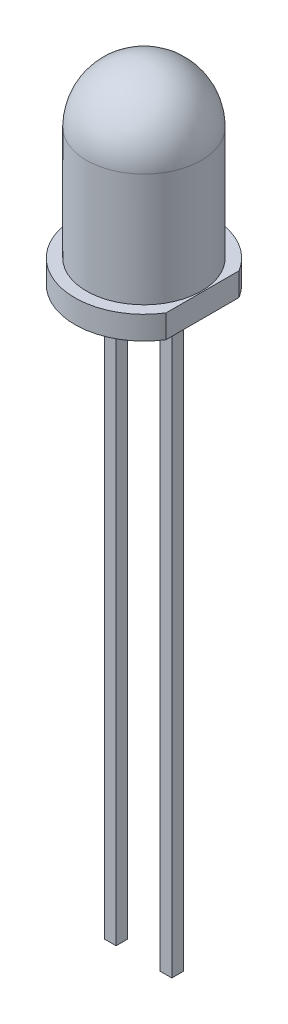
ISO-10303-21;
HEADER;
FILE_DESCRIPTION(('STEP AP214'),'2;1');
FILE_NAME('part.step','',(''),(''),'','','');
FILE_SCHEMA(('AUTOMOTIVE_DESIGN { 1 0 10303 214 1 1 1 1 }'));
ENDSEC;
DATA;
#1=APPLICATION_CONTEXT('core data for automotive mechanical design processes');
#2=APPLICATION_PROTOCOL_DEFINITION('international standard','automotive_design',2000,#1);
#3=PRODUCT_CONTEXT('',#1,'mechanical');
#4=PRODUCT('Part','Part','',(#3));
#5=PRODUCT_RELATED_PRODUCT_CATEGORY('part','',(#4));
#6=PRODUCT_DEFINITION_FORMATION('','',#4);
#7=PRODUCT_DEFINITION_CONTEXT('part definition',#1,'design');
#8=PRODUCT_DEFINITION('design','',#6,#7);
#9=PRODUCT_DEFINITION_SHAPE('','',#8);
#10=(LENGTH_UNIT() NAMED_UNIT(*) SI_UNIT(.MILLI.,.METRE.));
#11=(NAMED_UNIT(*) PLANE_ANGLE_UNIT() SI_UNIT($,.RADIAN.));
#12=(NAMED_UNIT(*) SI_UNIT($,.STERADIAN.) SOLID_ANGLE_UNIT());
#13=UNCERTAINTY_MEASURE_WITH_UNIT(LENGTH_MEASURE(1.E-05),#10,'distance_accuracy_value','');
#14=(GEOMETRIC_REPRESENTATION_CONTEXT(3) GLOBAL_UNCERTAINTY_ASSIGNED_CONTEXT((#13)) GLOBAL_UNIT_ASSIGNED_CONTEXT((#10,
#11,#12)) REPRESENTATION_CONTEXT('',''));
#15=CARTESIAN_POINT('',(0.,0.,0.));
#16=DIRECTION('',(0.,0.,1.));
#17=DIRECTION('',(1.,0.,0.));
#18=AXIS2_PLACEMENT_3D('',#15,#16,#17);
#19=CARTESIAN_POINT('',(0.,0.,0.));
#20=DIRECTION('',(0.,1.,0.));
#21=DIRECTION('',(0.,0.,1.));
#22=AXIS2_PLACEMENT_3D('',#19,#20,#21);
#23=PLANE('',#22);
#24=DIRECTION('',(0.,0.,-1.));
#25=VECTOR('',#24,1.);
#26=CARTESIAN_POINT('',(0.95,0.,0.25));
#27=LINE('',#26,#25);
#28=CARTESIAN_POINT('',(0.95,0.,0.25));
#29=VERTEX_POINT('',#28);
#30=CARTESIAN_POINT('',(0.95,0.,-0.25));
#31=VERTEX_POINT('',#30);
#32=EDGE_CURVE('E141',#29,#31,#27,.T.);
#33=ORIENTED_EDGE('',*,*,#32,.F.);
#34=DIRECTION('',(-1.,0.,0.));
#35=VECTOR('',#34,1.);
#36=CARTESIAN_POINT('',(0.95,0.,0.25));
#37=LINE('',#36,#35);
#38=CARTESIAN_POINT('',(1.45,0.,0.25));
#39=VERTEX_POINT('',#38);
#40=EDGE_CURVE('E157',#39,#29,#37,.T.);
#41=ORIENTED_EDGE('',*,*,#40,.F.);
#42=DIRECTION('',(0.,0.,1.));
#43=VECTOR('',#42,1.);
#44=CARTESIAN_POINT('',(1.45,0.,0.25));
#45=LINE('',#44,#43);
#46=CARTESIAN_POINT('',(1.45,0.,-0.25));
#47=VERTEX_POINT('',#46);
#48=EDGE_CURVE('E170',#47,#39,#45,.T.);
#49=ORIENTED_EDGE('',*,*,#48,.F.);
#50=DIRECTION('',(1.,0.,0.));
#51=VECTOR('',#50,1.);
#52=CARTESIAN_POINT('',(0.95,0.,-0.25));
#53=LINE('',#52,#51);
#54=EDGE_CURVE('E146',#31,#47,#53,.T.);
#55=ORIENTED_EDGE('',*,*,#54,.F.);
#56=EDGE_LOOP('',(#33,#41,#49,#55));
#57=FACE_BOUND('',#56,.T.);
#58=CARTESIAN_POINT('',(0.,0.,0.));
#59=DIRECTION('',(0.,1.,0.));
#60=DIRECTION('',(0.,0.,1.));
#61=AXIS2_PLACEMENT_3D('',#58,#59,#60);
#62=CIRCLE('',#61,2.975);
#63=CARTESIAN_POINT('',(2.525,0.,-1.57321327225523));
#64=VERTEX_POINT('',#63);
#65=CARTESIAN_POINT('',(2.525,0.,1.57321327225523));
#66=VERTEX_POINT('',#65);
#67=EDGE_CURVE('E200',#64,#66,#62,.T.);
#68=ORIENTED_EDGE('',*,*,#67,.F.);
#69=DIRECTION('',(0.,0.,-1.));
#70=VECTOR('',#69,1.);
#71=CARTESIAN_POINT('',(2.525,0.,1.57321327225523));
#72=LINE('',#71,#70);
#73=EDGE_CURVE('E206',#66,#64,#72,.T.);
#74=ORIENTED_EDGE('',*,*,#73,.F.);
#75=EDGE_LOOP('',(#68,#74));
#76=FACE_BOUND('',#75,.T.);
#77=DIRECTION('',(0.,0.,-1.));
#78=VECTOR('',#77,1.);
#79=CARTESIAN_POINT('',(-1.45,0.,0.25));
#80=LINE('',#79,#78);
#81=CARTESIAN_POINT('',(-1.45,0.,0.25));
#82=VERTEX_POINT('',#81);
#83=CARTESIAN_POINT('',(-1.45,0.,-0.25));
#84=VERTEX_POINT('',#83);
#85=EDGE_CURVE('E139',#82,#84,#80,.T.);
#86=ORIENTED_EDGE('',*,*,#85,.F.);
#87=DIRECTION('',(-1.,0.,0.));
#88=VECTOR('',#87,1.);
#89=CARTESIAN_POINT('',(-1.45,0.,0.25));
#90=LINE('',#89,#88);
#91=CARTESIAN_POINT('',(-0.95,0.,0.25));
#92=VERTEX_POINT('',#91);
#93=EDGE_CURVE('E136',#92,#82,#90,.T.);
#94=ORIENTED_EDGE('',*,*,#93,.F.);
#95=DIRECTION('',(0.,0.,1.));
#96=VECTOR('',#95,1.);
#97=CARTESIAN_POINT('',(-0.95,0.,0.25));
#98=LINE('',#97,#96);
#99=CARTESIAN_POINT('',(-0.95,0.,-0.25));
#100=VERTEX_POINT('',#99);
#101=EDGE_CURVE('E60',#100,#92,#98,.T.);
#102=ORIENTED_EDGE('',*,*,#101,.F.);
#103=DIRECTION('',(1.,0.,0.));
#104=VECTOR('',#103,1.);
#105=CARTESIAN_POINT('',(-1.45,0.,-0.25));
#106=LINE('',#105,#104);
#107=EDGE_CURVE('E55',#84,#100,#106,.T.);
#108=ORIENTED_EDGE('',*,*,#107,.F.);
#109=EDGE_LOOP('',(#86,#94,#102,#108));
#110=FACE_BOUND('',#109,.T.);
#111=ADVANCED_FACE('F39',(#57,#76,#110),#23,.F.);
#112=CARTESIAN_POINT('',(0.,1.,0.));
#113=DIRECTION('',(0.,-1.,0.));
#114=DIRECTION('',(0.,0.,-1.));
#115=AXIS2_PLACEMENT_3D('',#112,#113,#114);
#116=CYLINDRICAL_SURFACE('',#115,2.975);
#117=ORIENTED_EDGE('',*,*,#67,.T.);
#118=DIRECTION('',(0.,-1.,0.));
#119=VECTOR('',#118,1.);
#120=CARTESIAN_POINT('',(2.525,1.,1.57321327225523));
#121=LINE('',#120,#119);
#122=CARTESIAN_POINT('',(2.525,1.,1.57321327225523));
#123=VERTEX_POINT('',#122);
#124=EDGE_CURVE('E11',#123,#66,#121,.T.);
#125=ORIENTED_EDGE('',*,*,#124,.F.);
#126=CARTESIAN_POINT('',(0.,1.,0.));
#127=DIRECTION('',(0.,1.,0.));
#128=DIRECTION('',(0.,0.,1.));
#129=AXIS2_PLACEMENT_3D('',#126,#127,#128);
#130=CIRCLE('',#129,2.975);
#131=CARTESIAN_POINT('',(2.525,1.,-1.57321327225523));
#132=VERTEX_POINT('',#131);
#133=EDGE_CURVE('E201',#132,#123,#130,.T.);
#134=ORIENTED_EDGE('',*,*,#133,.F.);
#135=DIRECTION('',(0.,-1.,0.));
#136=VECTOR('',#135,1.);
#137=CARTESIAN_POINT('',(2.525,1.,-1.57321327225523));
#138=LINE('',#137,#136);
#139=EDGE_CURVE('E48',#132,#64,#138,.T.);
#140=ORIENTED_EDGE('',*,*,#139,.T.);
#141=EDGE_LOOP('',(#117,#125,#134,#140));
#142=FACE_BOUND('',#141,.T.);
#143=ADVANCED_FACE('F41',(#142),#116,.T.);
#144=CARTESIAN_POINT('',(2.525,1.,1.57321327225523));
#145=DIRECTION('',(-1.,0.,0.));
#146=DIRECTION('',(0.,0.,1.));
#147=AXIS2_PLACEMENT_3D('',#144,#145,#146);
#148=PLANE('',#147);
#149=ORIENTED_EDGE('',*,*,#73,.T.);
#150=ORIENTED_EDGE('',*,*,#139,.F.);
#151=DIRECTION('',(0.,0.,-1.));
#152=VECTOR('',#151,1.);
#153=CARTESIAN_POINT('',(2.525,1.,1.57321327225523));
#154=LINE('',#153,#152);
#155=EDGE_CURVE('E205',#123,#132,#154,.T.);
#156=ORIENTED_EDGE('',*,*,#155,.F.);
#157=ORIENTED_EDGE('',*,*,#124,.T.);
#158=EDGE_LOOP('',(#149,#150,#156,#157));
#159=FACE_BOUND('',#158,.T.);
#160=ADVANCED_FACE('F222',(#159),#148,.F.);
#161=CARTESIAN_POINT('',(0.,1.,0.));
#162=DIRECTION('',(0.,1.,0.));
#163=DIRECTION('',(0.,0.,1.));
#164=AXIS2_PLACEMENT_3D('',#161,#162,#163);
#165=PLANE('',#164);
#166=CARTESIAN_POINT('',(0.,1.,0.));
#167=DIRECTION('',(0.,-1.,0.));
#168=DIRECTION('',(0.,0.,-1.));
#169=AXIS2_PLACEMENT_3D('',#166,#167,#168);
#170=CIRCLE('',#169,2.475);
#171=CARTESIAN_POINT('',(0.,1.,-2.475));
#172=VERTEX_POINT('',#171);
#173=EDGE_CURVE('E196',#172,#172,#170,.T.);
#174=ORIENTED_EDGE('',*,*,#173,.T.);
#175=EDGE_LOOP('',(#174));
#176=FACE_BOUND('',#175,.T.);
#177=ORIENTED_EDGE('',*,*,#133,.T.);
#178=ORIENTED_EDGE('',*,*,#155,.T.);
#179=EDGE_LOOP('',(#177,#178));
#180=FACE_BOUND('',#179,.T.);
#181=ADVANCED_FACE('F224',(#176,#180),#165,.T.);
#182=CARTESIAN_POINT('',(0.,5.875,0.));
#183=DIRECTION('',(0.,-1.,0.));
#184=DIRECTION('',(-1.,0.,0.));
#185=AXIS2_PLACEMENT_3D('',#182,#183,#184);
#186=SPHERICAL_SURFACE('',#185,2.475);
#187=CARTESIAN_POINT('',(0.,5.875,0.));
#188=DIRECTION('',(0.,-1.,0.));
#189=DIRECTION('',(0.,0.,-1.));
#190=AXIS2_PLACEMENT_3D('',#187,#188,#189);
#191=CIRCLE('',#190,2.475);
#192=CARTESIAN_POINT('',(0.,5.875,-2.475));
#193=VERTEX_POINT('',#192);
#194=EDGE_CURVE('E192',#193,#193,#191,.T.);
#195=ORIENTED_EDGE('',*,*,#194,.F.);
#196=EDGE_LOOP('',(#195));
#197=FACE_BOUND('',#196,.T.);
#198=ADVANCED_FACE('F226',(#197),#186,.T.);
#199=CARTESIAN_POINT('',(0.,0.,0.));
#200=DIRECTION('',(0.,-1.,0.));
#201=DIRECTION('',(0.,0.,-1.));
#202=AXIS2_PLACEMENT_3D('',#199,#200,#201);
#203=CYLINDRICAL_SURFACE('',#202,2.475);
#204=ORIENTED_EDGE('',*,*,#173,.F.);
#205=EDGE_LOOP('',(#204));
#206=FACE_BOUND('',#205,.T.);
#207=ORIENTED_EDGE('',*,*,#194,.T.);
#208=EDGE_LOOP('',(#207));
#209=FACE_BOUND('',#208,.T.);
#210=ADVANCED_FACE('F233',(#206,#209),#203,.T.);
#211=CARTESIAN_POINT('',(0.95,-25.,0.25));
#212=DIRECTION('',(1.,0.,0.));
#213=DIRECTION('',(0.,0.,-1.));
#214=AXIS2_PLACEMENT_3D('',#211,#212,#213);
#215=PLANE('',#214);
#216=ORIENTED_EDGE('',*,*,#32,.T.);
#217=DIRECTION('',(0.,1.,0.));
#218=VECTOR('',#217,1.);
#219=CARTESIAN_POINT('',(0.95,-25.,-0.25));
#220=LINE('',#219,#218);
#221=CARTESIAN_POINT('',(0.95,-25.,-0.25));
#222=VERTEX_POINT('',#221);
#223=EDGE_CURVE('E188',#222,#31,#220,.T.);
#224=ORIENTED_EDGE('',*,*,#223,.F.);
#225=DIRECTION('',(0.,0.,-1.));
#226=VECTOR('',#225,1.);
#227=CARTESIAN_POINT('',(0.95,-25.,0.25));
#228=LINE('',#227,#226);
#229=CARTESIAN_POINT('',(0.95,-25.,0.25));
#230=VERTEX_POINT('',#229);
#231=EDGE_CURVE('E152',#230,#222,#228,.T.);
#232=ORIENTED_EDGE('',*,*,#231,.F.);
#233=DIRECTION('',(0.,1.,0.));
#234=VECTOR('',#233,1.);
#235=CARTESIAN_POINT('',(0.95,-25.,0.25));
#236=LINE('',#235,#234);
#237=EDGE_CURVE('E165',#230,#29,#236,.T.);
#238=ORIENTED_EDGE('',*,*,#237,.T.);
#239=EDGE_LOOP('',(#216,#224,#232,#238));
#240=FACE_BOUND('',#239,.T.);
#241=ADVANCED_FACE('F250',(#240),#215,.F.);
#242=CARTESIAN_POINT('',(0.95,-25.,-0.25));
#243=DIRECTION('',(0.,0.,1.));
#244=DIRECTION('',(1.,0.,0.));
#245=AXIS2_PLACEMENT_3D('',#242,#243,#244);
#246=PLANE('',#245);
#247=ORIENTED_EDGE('',*,*,#54,.T.);
#248=DIRECTION('',(0.,1.,0.));
#249=VECTOR('',#248,1.);
#250=CARTESIAN_POINT('',(1.45,-25.,-0.25));
#251=LINE('',#250,#249);
#252=CARTESIAN_POINT('',(1.45,-25.,-0.25));
#253=VERTEX_POINT('',#252);
#254=EDGE_CURVE('E184',#253,#47,#251,.T.);
#255=ORIENTED_EDGE('',*,*,#254,.F.);
#256=DIRECTION('',(1.,0.,0.));
#257=VECTOR('',#256,1.);
#258=CARTESIAN_POINT('',(0.95,-25.,-0.25));
#259=LINE('',#258,#257);
#260=EDGE_CURVE('E156',#222,#253,#259,.T.);
#261=ORIENTED_EDGE('',*,*,#260,.F.);
#262=ORIENTED_EDGE('',*,*,#223,.T.);
#263=EDGE_LOOP('',(#247,#255,#261,#262));
#264=FACE_BOUND('',#263,.T.);
#265=ADVANCED_FACE('F258',(#264),#246,.F.);
#266=CARTESIAN_POINT('',(1.45,-25.,0.25));
#267=DIRECTION('',(-1.,0.,0.));
#268=DIRECTION('',(0.,0.,1.));
#269=AXIS2_PLACEMENT_3D('',#266,#267,#268);
#270=PLANE('',#269);
#271=ORIENTED_EDGE('',*,*,#48,.T.);
#272=DIRECTION('',(0.,1.,0.));
#273=VECTOR('',#272,1.);
#274=CARTESIAN_POINT('',(1.45,-25.,0.25));
#275=LINE('',#274,#273);
#276=CARTESIAN_POINT('',(1.45,-25.,0.25));
#277=VERTEX_POINT('',#276);
#278=EDGE_CURVE('E180',#277,#39,#275,.T.);
#279=ORIENTED_EDGE('',*,*,#278,.F.);
#280=DIRECTION('',(0.,0.,1.));
#281=VECTOR('',#280,1.);
#282=CARTESIAN_POINT('',(1.45,-25.,0.25));
#283=LINE('',#282,#281);
#284=EDGE_CURVE('E160',#253,#277,#283,.T.);
#285=ORIENTED_EDGE('',*,*,#284,.F.);
#286=ORIENTED_EDGE('',*,*,#254,.T.);
#287=EDGE_LOOP('',(#271,#279,#285,#286));
#288=FACE_BOUND('',#287,.T.);
#289=ADVANCED_FACE('F256',(#288),#270,.F.);
#290=CARTESIAN_POINT('',(0.95,-25.,0.25));
#291=DIRECTION('',(0.,0.,-1.));
#292=DIRECTION('',(-1.,0.,0.));
#293=AXIS2_PLACEMENT_3D('',#290,#291,#292);
#294=PLANE('',#293);
#295=ORIENTED_EDGE('',*,*,#40,.T.);
#296=ORIENTED_EDGE('',*,*,#237,.F.);
#297=DIRECTION('',(-1.,0.,0.));
#298=VECTOR('',#297,1.);
#299=CARTESIAN_POINT('',(0.95,-25.,0.25));
#300=LINE('',#299,#298);
#301=EDGE_CURVE('E163',#277,#230,#300,.T.);
#302=ORIENTED_EDGE('',*,*,#301,.F.);
#303=ORIENTED_EDGE('',*,*,#278,.T.);
#304=EDGE_LOOP('',(#295,#296,#302,#303));
#305=FACE_BOUND('',#304,.T.);
#306=ADVANCED_FACE('F246',(#305),#294,.F.);
#307=CARTESIAN_POINT('',(0.,-25.,0.));
#308=DIRECTION('',(0.,-1.,0.));
#309=DIRECTION('',(0.,0.,-1.));
#310=AXIS2_PLACEMENT_3D('',#307,#308,#309);
#311=PLANE('',#310);
#312=ORIENTED_EDGE('',*,*,#231,.T.);
#313=ORIENTED_EDGE('',*,*,#260,.T.);
#314=ORIENTED_EDGE('',*,*,#284,.T.);
#315=ORIENTED_EDGE('',*,*,#301,.T.);
#316=EDGE_LOOP('',(#312,#313,#314,#315));
#317=FACE_BOUND('',#316,.T.);
#318=ADVANCED_FACE('F252',(#317),#311,.T.);
#319=CARTESIAN_POINT('',(-1.45,-25.,0.25));
#320=DIRECTION('',(1.,0.,0.));
#321=DIRECTION('',(0.,0.,-1.));
#322=AXIS2_PLACEMENT_3D('',#319,#320,#321);
#323=PLANE('',#322);
#324=ORIENTED_EDGE('',*,*,#85,.T.);
#325=DIRECTION('',(0.,1.,0.));
#326=VECTOR('',#325,1.);
#327=CARTESIAN_POINT('',(-1.45,-25.,-0.25));
#328=LINE('',#327,#326);
#329=CARTESIAN_POINT('',(-1.45,-25.,-0.25));
#330=VERTEX_POINT('',#329);
#331=EDGE_CURVE('E118',#330,#84,#328,.T.);
#332=ORIENTED_EDGE('',*,*,#331,.F.);
#333=DIRECTION('',(0.,0.,-1.));
#334=VECTOR('',#333,1.);
#335=CARTESIAN_POINT('',(-1.45,-25.,0.25));
#336=LINE('',#335,#334);
#337=CARTESIAN_POINT('',(-1.45,-25.,0.25));
#338=VERTEX_POINT('',#337);
#339=EDGE_CURVE('E126',#338,#330,#336,.T.);
#340=ORIENTED_EDGE('',*,*,#339,.F.);
#341=DIRECTION('',(0.,1.,0.));
#342=VECTOR('',#341,1.);
#343=CARTESIAN_POINT('',(-1.45,-25.,0.25));
#344=LINE('',#343,#342);
#345=EDGE_CURVE('E359',#338,#82,#344,.T.);
#346=ORIENTED_EDGE('',*,*,#345,.T.);
#347=EDGE_LOOP('',(#324,#332,#340,#346));
#348=FACE_BOUND('',#347,.T.);
#349=ADVANCED_FACE('F138',(#348),#323,.F.);
#350=CARTESIAN_POINT('',(-1.45,-25.,-0.25));
#351=DIRECTION('',(0.,0.,1.));
#352=DIRECTION('',(1.,0.,0.));
#353=AXIS2_PLACEMENT_3D('',#350,#351,#352);
#354=PLANE('',#353);
#355=ORIENTED_EDGE('',*,*,#107,.T.);
#356=DIRECTION('',(0.,1.,0.));
#357=VECTOR('',#356,1.);
#358=CARTESIAN_POINT('',(-0.95,-25.,-0.25));
#359=LINE('',#358,#357);
#360=CARTESIAN_POINT('',(-0.95,-25.,-0.25));
#361=VERTEX_POINT('',#360);
#362=EDGE_CURVE('E121',#361,#100,#359,.T.);
#363=ORIENTED_EDGE('',*,*,#362,.F.);
#364=DIRECTION('',(1.,0.,0.));
#365=VECTOR('',#364,1.);
#366=CARTESIAN_POINT('',(-1.45,-25.,-0.25));
#367=LINE('',#366,#365);
#368=EDGE_CURVE('E114',#330,#361,#367,.T.);
#369=ORIENTED_EDGE('',*,*,#368,.F.);
#370=ORIENTED_EDGE('',*,*,#331,.T.);
#371=EDGE_LOOP('',(#355,#363,#369,#370));
#372=FACE_BOUND('',#371,.T.);
#373=ADVANCED_FACE('F116',(#372),#354,.F.);
#374=CARTESIAN_POINT('',(-0.95,-25.,0.25));
#375=DIRECTION('',(-1.,0.,0.));
#376=DIRECTION('',(0.,0.,1.));
#377=AXIS2_PLACEMENT_3D('',#374,#375,#376);
#378=PLANE('',#377);
#379=ORIENTED_EDGE('',*,*,#101,.T.);
#380=DIRECTION('',(0.,1.,0.));
#381=VECTOR('',#380,1.);
#382=CARTESIAN_POINT('',(-0.95,-25.,0.25));
#383=LINE('',#382,#381);
#384=CARTESIAN_POINT('',(-0.95,-25.,0.25));
#385=VERTEX_POINT('',#384);
#386=EDGE_CURVE('E148',#385,#92,#383,.T.);
#387=ORIENTED_EDGE('',*,*,#386,.F.);
#388=DIRECTION('',(0.,0.,1.));
#389=VECTOR('',#388,1.);
#390=CARTESIAN_POINT('',(-0.95,-25.,0.25));
#391=LINE('',#390,#389);
#392=EDGE_CURVE('E125',#361,#385,#391,.T.);
#393=ORIENTED_EDGE('',*,*,#392,.F.);
#394=ORIENTED_EDGE('',*,*,#362,.T.);
#395=EDGE_LOOP('',(#379,#387,#393,#394));
#396=FACE_BOUND('',#395,.T.);
#397=ADVANCED_FACE('F326',(#396),#378,.F.);
#398=CARTESIAN_POINT('',(-1.45,-25.,0.25));
#399=DIRECTION('',(0.,0.,-1.));
#400=DIRECTION('',(-1.,0.,0.));
#401=AXIS2_PLACEMENT_3D('',#398,#399,#400);
#402=PLANE('',#401);
#403=ORIENTED_EDGE('',*,*,#93,.T.);
#404=ORIENTED_EDGE('',*,*,#345,.F.);
#405=DIRECTION('',(-1.,0.,0.));
#406=VECTOR('',#405,1.);
#407=CARTESIAN_POINT('',(-1.45,-25.,0.25));
#408=LINE('',#407,#406);
#409=EDGE_CURVE('E131',#385,#338,#408,.T.);
#410=ORIENTED_EDGE('',*,*,#409,.F.);
#411=ORIENTED_EDGE('',*,*,#386,.T.);
#412=EDGE_LOOP('',(#403,#404,#410,#411));
#413=FACE_BOUND('',#412,.T.);
#414=ADVANCED_FACE('F335',(#413),#402,.F.);
#415=CARTESIAN_POINT('',(0.,-25.,0.));
#416=DIRECTION('',(0.,-1.,0.));
#417=DIRECTION('',(0.,0.,-1.));
#418=AXIS2_PLACEMENT_3D('',#415,#416,#417);
#419=PLANE('',#418);
#420=ORIENTED_EDGE('',*,*,#339,.T.);
#421=ORIENTED_EDGE('',*,*,#368,.T.);
#422=ORIENTED_EDGE('',*,*,#392,.T.);
#423=ORIENTED_EDGE('',*,*,#409,.T.);
#424=EDGE_LOOP('',(#420,#421,#422,#423));
#425=FACE_BOUND('',#424,.T.);
#426=ADVANCED_FACE('F129',(#425),#419,.T.);
#427=CLOSED_SHELL('',(#111,#143,#160,#181,#198,#210,#241,#265,#289,#306,#318,#349,#373,#397,
#414,#426));
#428=MANIFOLD_SOLID_BREP('B2',#427);
#429=ADVANCED_BREP_SHAPE_REPRESENTATION('',(#18,#428),#14);
#430=SHAPE_DEFINITION_REPRESENTATION(#9,#429);
ENDSEC;
END-ISO-10303-21;
